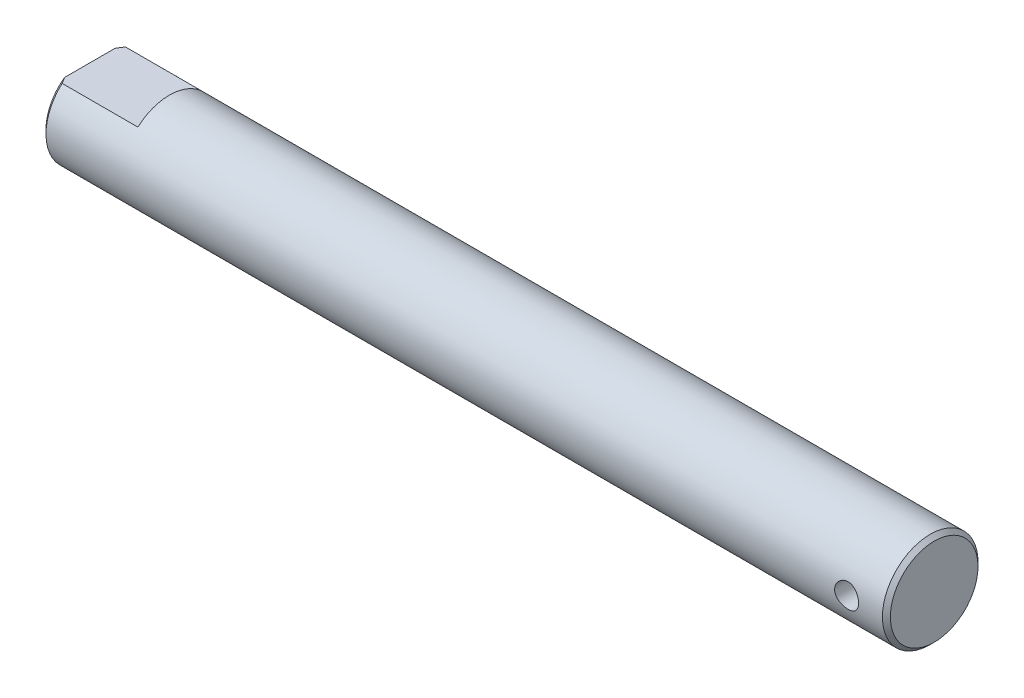
ISO-10303-21;
HEADER;
FILE_DESCRIPTION(('STEP AP214'),'2;1');
FILE_NAME('part.step','',(''),(''),'','','');
FILE_SCHEMA(('AUTOMOTIVE_DESIGN { 1 0 10303 214 1 1 1 1 }'));
ENDSEC;
DATA;
#1=APPLICATION_CONTEXT('core data for automotive mechanical design processes');
#2=APPLICATION_PROTOCOL_DEFINITION('international standard','automotive_design',2000,#1);
#3=PRODUCT_CONTEXT('',#1,'mechanical');
#4=PRODUCT('Part','Part','',(#3));
#5=PRODUCT_RELATED_PRODUCT_CATEGORY('part','',(#4));
#6=PRODUCT_DEFINITION_FORMATION('','',#4);
#7=PRODUCT_DEFINITION_CONTEXT('part definition',#1,'design');
#8=PRODUCT_DEFINITION('design','',#6,#7);
#9=PRODUCT_DEFINITION_SHAPE('','',#8);
#10=(LENGTH_UNIT() NAMED_UNIT(*) SI_UNIT(.MILLI.,.METRE.));
#11=(NAMED_UNIT(*) PLANE_ANGLE_UNIT() SI_UNIT($,.RADIAN.));
#12=(NAMED_UNIT(*) SI_UNIT($,.STERADIAN.) SOLID_ANGLE_UNIT());
#13=UNCERTAINTY_MEASURE_WITH_UNIT(LENGTH_MEASURE(1.E-05),#10,'distance_accuracy_value','');
#14=(GEOMETRIC_REPRESENTATION_CONTEXT(3) GLOBAL_UNCERTAINTY_ASSIGNED_CONTEXT((#13)) GLOBAL_UNIT_ASSIGNED_CONTEXT((#10,
#11,#12)) REPRESENTATION_CONTEXT('',''));
#15=CARTESIAN_POINT('',(0.,0.,0.));
#16=DIRECTION('',(0.,0.,1.));
#17=DIRECTION('',(1.,0.,0.));
#18=AXIS2_PLACEMENT_3D('',#15,#16,#17);
#19=CARTESIAN_POINT('',(106.,0.,0.));
#20=DIRECTION('',(-1.,0.,0.));
#21=DIRECTION('',(0.,0.,1.));
#22=AXIS2_PLACEMENT_3D('',#19,#20,#21);
#23=CYLINDRICAL_SURFACE('',#22,6.);
#24=CARTESIAN_POINT('',(102.5,0.,-6.));
#25=CARTESIAN_POINT('',(102.499997674262,0.0828760886697307,-5.99999859868013));
#26=CARTESIAN_POINT('',(102.493108449226,0.165778157830762,-5.99826578131828));
#27=CARTESIAN_POINT('',(102.465774848693,0.329206323770532,-5.99152113829892));
#28=CARTESIAN_POINT('',(102.445322790462,0.409731046870739,-5.98650745419968));
#29=CARTESIAN_POINT('',(102.391560746538,0.566020872182577,-5.9737562633204));
#30=CARTESIAN_POINT('',(102.358266201285,0.641791563430003,-5.96602202842087));
#31=CARTESIAN_POINT('',(102.279818609955,0.786672131904426,-5.94865343807593));
#32=CARTESIAN_POINT('',(102.234665163881,0.855781784348759,-5.9390190185405));
#33=CARTESIAN_POINT('',(102.132799210346,0.986801927300917,-5.91867413591801));
#34=CARTESIAN_POINT('',(102.075888425041,1.04855569006107,-5.90794707148533));
#35=CARTESIAN_POINT('',(101.952547795091,1.1617489272033,-5.8867362011753));
#36=CARTESIAN_POINT('',(101.886116877053,1.21318723694913,-5.87625242288348));
#37=CARTESIAN_POINT('',(101.744404773263,1.30502654279903,-5.8565477569971));
#38=CARTESIAN_POINT('',(101.66900676919,1.34525221592535,-5.84734794470605));
#39=CARTESIAN_POINT('',(101.512251588342,1.41239690855052,-5.83149494812223));
#40=CARTESIAN_POINT('',(101.430895366674,1.43931805543933,-5.82484135672789));
#41=CARTESIAN_POINT('',(101.266256501798,1.47855483680429,-5.81500476717551));
#42=CARTESIAN_POINT('',(101.18304510395,1.49115226833334,-5.81175491075426));
#43=CARTESIAN_POINT('',(101.015631430986,1.50226177506785,-5.80889362537741));
#44=CARTESIAN_POINT('',(100.931429319301,1.50077614181797,-5.80928160448644));
#45=CARTESIAN_POINT('',(100.766584192256,1.48398652463928,-5.81359205496618));
#46=CARTESIAN_POINT('',(100.685904378535,1.46901834019052,-5.81742863001879));
#47=CARTESIAN_POINT('',(100.528238949089,1.42622418690311,-5.82806709676484));
#48=CARTESIAN_POINT('',(100.451253596971,1.39839730206942,-5.83486919970697));
#49=CARTESIAN_POINT('',(100.302261983748,1.33038947793715,-5.85075113904187));
#50=CARTESIAN_POINT('',(100.23031382821,1.29008666723291,-5.85985327469421));
#51=CARTESIAN_POINT('',(100.094081290243,1.19835627601495,-5.87929710846386));
#52=CARTESIAN_POINT('',(100.029798251933,1.14692674880883,-5.88963902334735));
#53=CARTESIAN_POINT('',(99.9087963843056,1.03266342468121,-5.91075880539781));
#54=CARTESIAN_POINT('',(99.8523455099387,0.969546258165854,-5.92154069477972));
#55=CARTESIAN_POINT('',(99.7507787575361,0.834611917503697,-5.94205965578786));
#56=CARTESIAN_POINT('',(99.7056632257364,0.762794477707943,-5.95179669549415));
#57=CARTESIAN_POINT('',(99.6279494137756,0.612115888681392,-5.96917732094183));
#58=CARTESIAN_POINT('',(99.5953946597456,0.533231393208621,-5.97681360127725));
#59=CARTESIAN_POINT('',(99.5440826942904,0.370876008142878,-5.98907916991419));
#60=CARTESIAN_POINT('',(99.5253228435819,0.287405999150478,-5.99370903339281));
#61=CARTESIAN_POINT('',(99.5025424344412,0.12053997039002,-5.99935499271375));
#62=CARTESIAN_POINT('',(99.4981569739247,0.0371967199882034,-6.00046053508279));
#63=CARTESIAN_POINT('',(99.5032490020555,-0.129032874801513,-5.99918804814451));
#64=CARTESIAN_POINT('',(99.5127252427991,-0.211919259644599,-5.99681033241847));
#65=CARTESIAN_POINT('',(99.5449709083914,-0.373614268776496,-5.98889581127357));
#66=CARTESIAN_POINT('',(99.567541263477,-0.452465118968761,-5.98340634185811));
#67=CARTESIAN_POINT('',(99.6251070840284,-0.605257292452517,-5.96988706634134));
#68=CARTESIAN_POINT('',(99.6601038043132,-0.679198119032638,-5.96185700369892));
#69=CARTESIAN_POINT('',(99.7422361288747,-0.821523134429849,-5.9439330792631));
#70=CARTESIAN_POINT('',(99.7895761123968,-0.889785441835834,-5.93400867366932));
#71=CARTESIAN_POINT('',(99.894789908797,-1.01752661364325,-5.91344509187419));
#72=CARTESIAN_POINT('',(99.9526655396169,-1.07700395897301,-5.90280579251705));
#73=CARTESIAN_POINT('',(100.079001960844,-1.18699056807273,-5.88168956960771));
#74=CARTESIAN_POINT('',(100.147687703002,-1.23724386762203,-5.87122304187281));
#75=CARTESIAN_POINT('',(100.292732634466,-1.3255107590127,-5.85192878377239));
#76=CARTESIAN_POINT('',(100.36909148296,-1.36352489415794,-5.84310098067026));
#77=CARTESIAN_POINT('',(100.526905722413,-1.42595142060929,-5.82818094734665));
#78=CARTESIAN_POINT('',(100.608327628344,-1.45044439665406,-5.82207255291906));
#79=CARTESIAN_POINT('',(100.774309637889,-1.48534565995377,-5.81326744090184));
#80=CARTESIAN_POINT('',(100.858869051032,-1.49575702747865,-5.81056997719936));
#81=CARTESIAN_POINT('',(101.026121023855,-1.50203859033399,-5.80894901203957));
#82=CARTESIAN_POINT('',(101.108797435125,-1.49831789778011,-5.80991932728264));
#83=CARTESIAN_POINT('',(101.272303888668,-1.47737727831286,-5.81527909007843));
#84=CARTESIAN_POINT('',(101.353133968014,-1.46015762268677,-5.81966846891857));
#85=CARTESIAN_POINT('',(101.510208459065,-1.41293131944279,-5.83131260682723));
#86=CARTESIAN_POINT('',(101.58647730524,-1.38300140468037,-5.8385501523631));
#87=CARTESIAN_POINT('',(101.732965382714,-1.31126491360507,-5.85507755724829));
#88=CARTESIAN_POINT('',(101.803183773187,-1.26945669003418,-5.86436770120773));
#89=CARTESIAN_POINT('',(101.937554629002,-1.17386774863713,-5.88425634263512));
#90=CARTESIAN_POINT('',(102.001501073424,-1.11980316291224,-5.89488264831757));
#91=CARTESIAN_POINT('',(102.119547044795,-1.00178937118972,-5.91608027246286));
#92=CARTESIAN_POINT('',(102.173644230113,-0.937837821261139,-5.9266515772706));
#93=CARTESIAN_POINT('',(102.271411308565,-0.800467586702586,-5.94677655647663));
#94=CARTESIAN_POINT('',(102.314874613672,-0.726898422316381,-5.95630833365868));
#95=CARTESIAN_POINT('',(102.388747462941,-0.573266059510468,-5.97304924975119));
#96=CARTESIAN_POINT('',(102.419166360649,-0.493207563436732,-5.98026005199781));
#97=CARTESIAN_POINT('',(102.46157183033,-0.344410253243466,-5.99048059565542));
#98=CARTESIAN_POINT('',(102.475951243053,-0.276380170908064,-5.99402585052691));
#99=CARTESIAN_POINT('',(102.495165943622,-0.138906071536281,-5.99878605231948));
#100=CARTESIAN_POINT('',(102.500001949305,-0.0694621612426151,-6.00000117450894));
#101=CARTESIAN_POINT('',(102.5,0.,-6.));
#102=B_SPLINE_CURVE_WITH_KNOTS('',3,(#24,#25,#26,#27,#28,#29,#30,#31,#32,#33,#34,#35,#36,#37,
#38,#39,#40,#41,#42,#43,#44,#45,#46,#47,#48,#49,#50,#51,#52,#53,#54,#55,#56,#57,#58,#59,#60,#61,
#62,#63,#64,#65,#66,#67,#68,#69,#70,#71,#72,#73,#74,#75,#76,#77,#78,#79,#80,#81,#82,#83,#84,#85,
#86,#87,#88,#89,#90,#91,#92,#93,#94,#95,#96,#97,#98,#99,#100,#101),.UNSPECIFIED.,.T.,.F.,(4,2,2,
2,2,2,2,2,2,2,2,2,2,2,2,2,2,2,2,2,2,2,2,2,2,2,2,2,2,2,2,2,2,2,2,2,2,2,4),(0.,0.248373712471889,
0.496888237763901,0.745104902286105,0.993329940169326,1.24614435437138,1.49898729580061,
1.75558647545806,2.01214461169368,2.2635629509943,2.51494038112696,2.76022497007017,
3.00552703466037,3.25330527873879,3.50112690836162,3.75601500969019,4.01091089558246,
4.26668229009113,4.52240473688642,4.77158308949276,5.02073901112742,5.26620274514037,
5.5116912732229,5.76153587565351,6.01142363008018,6.26744509204475,6.52345518749507,
6.77792254614035,7.03233423252406,7.27943780398612,7.52653640956033,7.77216400559445,
8.017825681369,8.26989576409911,8.52202569770416,8.77872185499586,9.03523363821349,
9.24342242942147,9.45159556043037),.UNSPECIFIED.);
#103=CARTESIAN_POINT('',(102.5,0.,-6.));
#104=VERTEX_POINT('',#103);
#105=EDGE_CURVE('E11',#104,#104,#102,.T.);
#106=ORIENTED_EDGE('',*,*,#105,.T.);
#107=EDGE_LOOP('',(#106));
#108=FACE_BOUND('',#107,.T.);
#109=CARTESIAN_POINT('',(102.5,0.,6.));
#110=CARTESIAN_POINT('',(102.499997674262,-0.0828760886697309,5.99999859868012));
#111=CARTESIAN_POINT('',(102.493108449226,-0.165778157830763,5.99826578131828));
#112=CARTESIAN_POINT('',(102.465774848693,-0.329206323770532,5.99152113829892));
#113=CARTESIAN_POINT('',(102.445322790462,-0.40973104687074,5.98650745419968));
#114=CARTESIAN_POINT('',(102.391560746538,-0.566020872182578,5.9737562633204));
#115=CARTESIAN_POINT('',(102.358266201285,-0.641791563430003,5.96602202842087));
#116=CARTESIAN_POINT('',(102.279818609955,-0.786672131904426,5.94865343807593));
#117=CARTESIAN_POINT('',(102.234665163881,-0.855781784348759,5.9390190185405));
#118=CARTESIAN_POINT('',(102.132799210346,-0.986801927300918,5.91867413591801));
#119=CARTESIAN_POINT('',(102.075888425041,-1.04855569006107,5.90794707148533));
#120=CARTESIAN_POINT('',(101.952547795091,-1.1617489272033,5.8867362011753));
#121=CARTESIAN_POINT('',(101.886116877053,-1.21318723694913,5.87625242288348));
#122=CARTESIAN_POINT('',(101.744404773263,-1.30502654279903,5.8565477569971));
#123=CARTESIAN_POINT('',(101.66900676919,-1.34525221592535,5.84734794470605));
#124=CARTESIAN_POINT('',(101.512251588342,-1.41239690855052,5.83149494812223));
#125=CARTESIAN_POINT('',(101.430895366674,-1.43931805543933,5.82484135672789));
#126=CARTESIAN_POINT('',(101.266256501798,-1.47855483680429,5.81500476717551));
#127=CARTESIAN_POINT('',(101.18304510395,-1.49115226833333,5.81175491075426));
#128=CARTESIAN_POINT('',(101.015631430986,-1.50226177506785,5.80889362537741));
#129=CARTESIAN_POINT('',(100.931429319301,-1.50077614181798,5.80928160448644));
#130=CARTESIAN_POINT('',(100.766584192256,-1.48398652463928,5.81359205496618));
#131=CARTESIAN_POINT('',(100.685904378535,-1.46901834019052,5.81742863001879));
#132=CARTESIAN_POINT('',(100.528238949089,-1.4262241869031,5.82806709676484));
#133=CARTESIAN_POINT('',(100.451253596971,-1.39839730206942,5.83486919970697));
#134=CARTESIAN_POINT('',(100.302261983748,-1.33038947793715,5.85075113904187));
#135=CARTESIAN_POINT('',(100.23031382821,-1.29008666723291,5.85985327469421));
#136=CARTESIAN_POINT('',(100.094081290243,-1.19835627601495,5.87929710846386));
#137=CARTESIAN_POINT('',(100.029798251933,-1.14692674880883,5.88963902334735));
#138=CARTESIAN_POINT('',(99.9087963843056,-1.03266342468121,5.91075880539781));
#139=CARTESIAN_POINT('',(99.8523455099387,-0.969546258165853,5.92154069477972));
#140=CARTESIAN_POINT('',(99.7507787575361,-0.834611917503697,5.94205965578786));
#141=CARTESIAN_POINT('',(99.7056632257364,-0.762794477707943,5.95179669549415));
#142=CARTESIAN_POINT('',(99.6279494137756,-0.612115888681391,5.96917732094183));
#143=CARTESIAN_POINT('',(99.5953946597456,-0.533231393208621,5.97681360127725));
#144=CARTESIAN_POINT('',(99.5440826942904,-0.370876008142877,5.98907916991419));
#145=CARTESIAN_POINT('',(99.5253228435819,-0.287405999150478,5.99370903339281));
#146=CARTESIAN_POINT('',(99.5025424344412,-0.120539970390019,5.99935499271375));
#147=CARTESIAN_POINT('',(99.4981569739247,-0.0371967199882027,6.00046053508279));
#148=CARTESIAN_POINT('',(99.5032490020555,0.129032874801514,5.99918804814451));
#149=CARTESIAN_POINT('',(99.5127252427991,0.211919259644599,5.99681033241847));
#150=CARTESIAN_POINT('',(99.5449709083914,0.373614268776497,5.98889581127357));
#151=CARTESIAN_POINT('',(99.567541263477,0.452465118968762,5.98340634185811));
#152=CARTESIAN_POINT('',(99.6251070840284,0.605257292452518,5.96988706634134));
#153=CARTESIAN_POINT('',(99.6601038043132,0.679198119032638,5.96185700369892));
#154=CARTESIAN_POINT('',(99.7422361288747,0.82152313442985,5.9439330792631));
#155=CARTESIAN_POINT('',(99.7895761123968,0.889785441835834,5.93400867366932));
#156=CARTESIAN_POINT('',(99.894789908797,1.01752661364325,5.91344509187419));
#157=CARTESIAN_POINT('',(99.9526655396169,1.07700395897301,5.90280579251705));
#158=CARTESIAN_POINT('',(100.079001960844,1.18699056807273,5.88168956960771));
#159=CARTESIAN_POINT('',(100.147687703002,1.23724386762203,5.87122304187281));
#160=CARTESIAN_POINT('',(100.292732634466,1.3255107590127,5.85192878377239));
#161=CARTESIAN_POINT('',(100.36909148296,1.36352489415794,5.84310098067026));
#162=CARTESIAN_POINT('',(100.526905722413,1.42595142060929,5.82818094734665));
#163=CARTESIAN_POINT('',(100.608327628344,1.45044439665406,5.82207255291906));
#164=CARTESIAN_POINT('',(100.774309637889,1.48534565995378,5.81326744090184));
#165=CARTESIAN_POINT('',(100.858869051032,1.49575702747866,5.81056997719936));
#166=CARTESIAN_POINT('',(101.026121023855,1.50203859033399,5.80894901203957));
#167=CARTESIAN_POINT('',(101.108797435125,1.49831789778011,5.80991932728264));
#168=CARTESIAN_POINT('',(101.272303888668,1.47737727831286,5.81527909007843));
#169=CARTESIAN_POINT('',(101.353133968014,1.46015762268677,5.81966846891857));
#170=CARTESIAN_POINT('',(101.510208459065,1.41293131944279,5.83131260682723));
#171=CARTESIAN_POINT('',(101.58647730524,1.38300140468037,5.8385501523631));
#172=CARTESIAN_POINT('',(101.732965382714,1.31126491360506,5.85507755724829));
#173=CARTESIAN_POINT('',(101.803183773187,1.26945669003418,5.86436770120773));
#174=CARTESIAN_POINT('',(101.937554629002,1.17386774863713,5.88425634263512));
#175=CARTESIAN_POINT('',(102.001501073424,1.11980316291224,5.89488264831757));
#176=CARTESIAN_POINT('',(102.119547044795,1.00178937118972,5.91608027246286));
#177=CARTESIAN_POINT('',(102.173644230113,0.937837821261138,5.9266515772706));
#178=CARTESIAN_POINT('',(102.271411308565,0.800467586702584,5.94677655647663));
#179=CARTESIAN_POINT('',(102.314874613672,0.726898422316379,5.95630833365868));
#180=CARTESIAN_POINT('',(102.388747462941,0.573266059510466,5.97304924975119));
#181=CARTESIAN_POINT('',(102.419166360649,0.49320756343673,5.98026005199781));
#182=CARTESIAN_POINT('',(102.46157183033,0.344410253243465,5.99048059565542));
#183=CARTESIAN_POINT('',(102.475951243053,0.276380170908063,5.99402585052691));
#184=CARTESIAN_POINT('',(102.495165943622,0.138906071536281,5.99878605231948));
#185=CARTESIAN_POINT('',(102.500001949305,0.0694621612426152,6.00000117450894));
#186=CARTESIAN_POINT('',(102.5,0.,6.));
#187=B_SPLINE_CURVE_WITH_KNOTS('',3,(#109,#110,#111,#112,#113,#114,#115,#116,#117,#118,#119,
#120,#121,#122,#123,#124,#125,#126,#127,#128,#129,#130,#131,#132,#133,#134,#135,#136,#137,#138,
#139,#140,#141,#142,#143,#144,#145,#146,#147,#148,#149,#150,#151,#152,#153,#154,#155,#156,#157,
#158,#159,#160,#161,#162,#163,#164,#165,#166,#167,#168,#169,#170,#171,#172,#173,#174,#175,#176,
#177,#178,#179,#180,#181,#182,#183,#184,#185,#186),.UNSPECIFIED.,.T.,.F.,(4,2,2,2,2,2,2,2,2,2,2,
2,2,2,2,2,2,2,2,2,2,2,2,2,2,2,2,2,2,2,2,2,2,2,2,2,2,2,4),(0.,0.24837371247189,0.496888237763901,
0.745104902286105,0.993329940169327,1.24614435437138,1.49898729580062,1.75558647545806,
2.01214461169368,2.26356295099429,2.51494038112696,2.76022497007018,3.00552703466038,
3.25330527873879,3.50112690836162,3.75601500969019,4.01091089558246,4.26668229009113,
4.52240473688643,4.77158308949276,5.02073901112742,5.26620274514037,5.5116912732229,
5.76153587565352,6.01142363008018,6.26744509204475,6.52345518749507,6.77792254614035,
7.03233423252408,7.27943780398612,7.52653640956034,7.77216400559447,8.017825681369,
8.26989576409911,8.52202569770416,8.77872185499588,9.03523363821349,9.24342242942148,
9.45159556043038),.UNSPECIFIED.);
#188=CARTESIAN_POINT('',(102.5,0.,6.));
#189=VERTEX_POINT('',#188);
#190=EDGE_CURVE('E53',#189,#189,#187,.T.);
#191=ORIENTED_EDGE('',*,*,#190,.T.);
#192=EDGE_LOOP('',(#191));
#193=FACE_BOUND('',#192,.T.);
#194=CARTESIAN_POINT('',(9.99999999999999,0.,0.));
#195=DIRECTION('',(-1.,0.,0.));
#196=DIRECTION('',(0.,0.,1.));
#197=AXIS2_PLACEMENT_3D('',#194,#195,#196);
#198=CIRCLE('',#197,6.);
#199=CARTESIAN_POINT('',(9.99999999999999,4.5,3.96862696659689));
#200=VERTEX_POINT('',#199);
#201=CARTESIAN_POINT('',(9.99999999999999,4.5,-3.96862696659689));
#202=VERTEX_POINT('',#201);
#203=EDGE_CURVE('E83',#200,#202,#198,.T.);
#204=ORIENTED_EDGE('',*,*,#203,.F.);
#205=DIRECTION('',(-1.,0.,0.));
#206=VECTOR('',#205,1.);
#207=CARTESIAN_POINT('',(106.,4.5,3.96862696659689));
#208=LINE('',#207,#206);
#209=CARTESIAN_POINT('',(0.499999999999987,4.5,3.96862696659689));
#210=VERTEX_POINT('',#209);
#211=EDGE_CURVE('E145',#200,#210,#208,.T.);
#212=ORIENTED_EDGE('',*,*,#211,.T.);
#213=CARTESIAN_POINT('',(0.499999999999987,0.,0.));
#214=DIRECTION('',(1.,0.,0.));
#215=DIRECTION('',(0.,0.,-1.));
#216=AXIS2_PLACEMENT_3D('',#213,#214,#215);
#217=CIRCLE('',#216,6.);
#218=CARTESIAN_POINT('',(0.499999999999987,4.5,-3.96862696659689));
#219=VERTEX_POINT('',#218);
#220=EDGE_CURVE('E94',#210,#219,#217,.T.);
#221=ORIENTED_EDGE('',*,*,#220,.T.);
#222=DIRECTION('',(-1.,0.,0.));
#223=VECTOR('',#222,1.);
#224=CARTESIAN_POINT('',(106.,4.5,-3.96862696659689));
#225=LINE('',#224,#223);
#226=EDGE_CURVE('E66',#219,#202,#225,.F.);
#227=ORIENTED_EDGE('',*,*,#226,.T.);
#228=EDGE_LOOP('',(#204,#212,#221,#227));
#229=FACE_BOUND('',#228,.T.);
#230=CARTESIAN_POINT('',(105.5,0.,0.));
#231=DIRECTION('',(1.,0.,0.));
#232=DIRECTION('',(0.,0.,-1.));
#233=AXIS2_PLACEMENT_3D('',#230,#231,#232);
#234=CIRCLE('',#233,6.);
#235=CARTESIAN_POINT('',(105.5,0.,-6.));
#236=VERTEX_POINT('',#235);
#237=EDGE_CURVE('E98',#236,#236,#234,.F.);
#238=ORIENTED_EDGE('',*,*,#237,.T.);
#239=EDGE_LOOP('',(#238));
#240=FACE_BOUND('',#239,.T.);
#241=ADVANCED_FACE('F39',(#108,#193,#229,#240),#23,.T.);
#242=CARTESIAN_POINT('',(106.,0.,0.));
#243=DIRECTION('',(1.,0.,0.));
#244=DIRECTION('',(0.,0.,-1.));
#245=AXIS2_PLACEMENT_3D('',#242,#243,#244);
#246=PLANE('',#245);
#247=CARTESIAN_POINT('',(106.,0.,0.));
#248=DIRECTION('',(1.,0.,0.));
#249=DIRECTION('',(0.,0.,-1.));
#250=AXIS2_PLACEMENT_3D('',#247,#248,#249);
#251=CIRCLE('',#250,5.50000000000003);
#252=CARTESIAN_POINT('',(106.,0.,-5.50000000000003));
#253=VERTEX_POINT('',#252);
#254=EDGE_CURVE('E93',#253,#253,#251,.T.);
#255=ORIENTED_EDGE('',*,*,#254,.T.);
#256=EDGE_LOOP('',(#255));
#257=FACE_BOUND('',#256,.T.);
#258=ADVANCED_FACE('F115',(#257),#246,.T.);
#259=CARTESIAN_POINT('',(0.,0.,0.));
#260=DIRECTION('',(1.,0.,0.));
#261=DIRECTION('',(0.,0.,-1.));
#262=AXIS2_PLACEMENT_3D('',#259,#260,#261);
#263=PLANE('',#262);
#264=CARTESIAN_POINT('',(0.,0.,0.));
#265=DIRECTION('',(1.,0.,0.));
#266=DIRECTION('',(0.,0.,-1.));
#267=AXIS2_PLACEMENT_3D('',#264,#265,#266);
#268=CIRCLE('',#267,5.49999999999999);
#269=CARTESIAN_POINT('',(0.,4.5,-3.16227766016837));
#270=VERTEX_POINT('',#269);
#271=CARTESIAN_POINT('',(0.,4.5,3.16227766016837));
#272=VERTEX_POINT('',#271);
#273=EDGE_CURVE('E89',#270,#272,#268,.F.);
#274=ORIENTED_EDGE('',*,*,#273,.T.);
#275=DIRECTION('',(0.,0.,1.));
#276=VECTOR('',#275,1.);
#277=CARTESIAN_POINT('',(0.,4.5,-5.76257927946265));
#278=LINE('',#277,#276);
#279=EDGE_CURVE('E60',#270,#272,#278,.T.);
#280=ORIENTED_EDGE('',*,*,#279,.F.);
#281=EDGE_LOOP('',(#274,#280));
#282=FACE_BOUND('',#281,.T.);
#283=ADVANCED_FACE('F88',(#282),#263,.F.);
#284=CARTESIAN_POINT('',(0.499999999999987,0.,0.));
#285=DIRECTION('',(1.,0.,0.));
#286=DIRECTION('',(0.,0.,-1.));
#287=AXIS2_PLACEMENT_3D('',#284,#285,#286);
#288=CONICAL_SURFACE('',#287,6.,0.785398163397471);
#289=CARTESIAN_POINT('',(0.500700000000324,4.5,-3.96968518777045));
#290=CARTESIAN_POINT('',(0.437009989957209,4.5,-3.87339264212766));
#291=CARTESIAN_POINT('',(0.374207673157163,4.5,-3.77650441507906));
#292=CARTESIAN_POINT('',(0.250693655070821,4.5,-3.58137101964523));
#293=CARTESIAN_POINT('',(0.189982495737876,4.5,-3.48312550860704));
#294=CARTESIAN_POINT('',(0.0706867410994751,4.5,-3.28464161125446));
#295=CARTESIAN_POINT('',(0.0121149862913564,4.5,-3.18439546930312));
#296=CARTESIAN_POINT('',(-0.102127102067324,4.5,-2.98227588858412));
#297=CARTESIAN_POINT('',(-0.157797627247815,4.5,-2.88040255787655));
#298=CARTESIAN_POINT('',(-0.322877952428692,4.5,-2.56614314186718));
#299=CARTESIAN_POINT('',(-0.426847271659996,4.5,-2.35083682891543));
#300=CARTESIAN_POINT('',(-0.614685979016808,4.5,-1.91191588938568));
#301=CARTESIAN_POINT('',(-0.698598528884141,4.5,-1.68832032192078));
#302=CARTESIAN_POINT('',(-0.810192158096138,4.5,-1.32682203176174));
#303=CARTESIAN_POINT('',(-0.846783123178628,4.5,-1.19167293079571));
#304=CARTESIAN_POINT('',(-0.909069667919463,4.5,-0.918838291994869));
#305=CARTESIAN_POINT('',(-0.934764908812977,4.5,-0.781152675434737));
#306=CARTESIAN_POINT('',(-0.973703163724229,4.5,-0.505686776709133));
#307=CARTESIAN_POINT('',(-0.987091375501523,4.5,-0.367927305666166));
#308=CARTESIAN_POINT('',(-1.00117673263348,4.5,-0.0917592093994528));
#309=CARTESIAN_POINT('',(-1.00187480943151,4.5,0.0466493674346533));
#310=CARTESIAN_POINT('',(-0.990536239138376,4.5,0.323024452129332));
#311=CARTESIAN_POINT('',(-0.978491362302788,4.5,0.460990616515674));
#312=CARTESIAN_POINT('',(-0.942347341385414,4.5,0.735324495961267));
#313=CARTESIAN_POINT('',(-0.918246800350637,4.5,0.871692023903557));
#314=CARTESIAN_POINT('',(-0.858874582924122,4.5,1.14362252943263));
#315=CARTESIAN_POINT('',(-0.823474826621658,4.5,1.27915717091655));
#316=CARTESIAN_POINT('',(-0.743127192322243,4.5,1.54732429372746));
#317=CARTESIAN_POINT('',(-0.698179339578131,4.5,1.67995678272906));
#318=CARTESIAN_POINT('',(-0.57679958662692,4.5,2.00507503766939));
#319=CARTESIAN_POINT('',(-0.495603685789314,4.5,2.19577611276917));
#320=CARTESIAN_POINT('',(-0.319949230992929,4.5,2.57108474811645));
#321=CARTESIAN_POINT('',(-0.22547654501121,4.5,2.75568555310627));
#322=CARTESIAN_POINT('',(-0.0293562287012536,4.5,3.11446237166649));
#323=CARTESIAN_POINT('',(0.0720246867940939,4.5,3.28878541271145));
#324=CARTESIAN_POINT('',(0.2292901234459,4.5,3.54674167901052));
#325=CARTESIAN_POINT('',(0.282501875963735,4.5,3.63202566750182));
#326=CARTESIAN_POINT('',(0.390482383121968,4.5,3.8015845938077));
#327=CARTESIAN_POINT('',(0.445250897175719,4.5,3.88585968471012));
#328=CARTESIAN_POINT('',(0.500699999999987,4.5,3.96968518776993));
#329=B_SPLINE_CURVE_WITH_KNOTS('',3,(#289,#290,#291,#292,#293,#294,#295,#296,#297,#298,#299,
#300,#301,#302,#303,#304,#305,#306,#307,#308,#309,#310,#311,#312,#313,#314,#315,#316,#317,#318,
#319,#320,#321,#322,#323,#324,#325,#326,#327,#328),.UNSPECIFIED.,.F.,.F.,(4,2,2,2,2,2,2,2,2,2,2,
2,2,2,2,2,2,2,2,4),(0.,0.346354756881394,0.692798611306342,1.04106163248083,1.38930162120604,
2.1058764853685,2.82089512487718,3.24056561164809,3.6602491456637,4.07491522819945,
4.48955087453195,4.90445446735145,5.31940614836541,5.73923924226722,6.15907122580686,
6.78014680302734,7.40188854186495,8.00663509482336,8.30819079976105,8.60970015206771),.UNSPECIFIED.);
#330=EDGE_CURVE('E77',#219,#270,#329,.T.);
#331=ORIENTED_EDGE('',*,*,#330,.F.);
#332=ORIENTED_EDGE('',*,*,#220,.F.);
#333=EDGE_CURVE('E84',#272,#210,#329,.T.);
#334=ORIENTED_EDGE('',*,*,#333,.F.);
#335=ORIENTED_EDGE('',*,*,#273,.F.);
#336=EDGE_LOOP('',(#331,#332,#334,#335));
#337=FACE_BOUND('',#336,.T.);
#338=ADVANCED_FACE('F92',(#337),#288,.T.);
#339=CARTESIAN_POINT('',(106.,0.,0.));
#340=DIRECTION('',(-1.,0.,0.));
#341=DIRECTION('',(0.,0.,1.));
#342=AXIS2_PLACEMENT_3D('',#339,#340,#341);
#343=CONICAL_SURFACE('',#342,5.50000000000003,0.785398163397458);
#344=ORIENTED_EDGE('',*,*,#237,.F.);
#345=EDGE_LOOP('',(#344));
#346=FACE_BOUND('',#345,.T.);
#347=ORIENTED_EDGE('',*,*,#254,.F.);
#348=EDGE_LOOP('',(#347));
#349=FACE_BOUND('',#348,.T.);
#350=ADVANCED_FACE('F42',(#346,#349),#343,.T.);
#351=CARTESIAN_POINT('',(10.,0.,0.));
#352=DIRECTION('',(-1.,0.,0.));
#353=DIRECTION('',(0.,0.,1.));
#354=AXIS2_PLACEMENT_3D('',#351,#352,#353);
#355=PLANE('',#354);
#356=ORIENTED_EDGE('',*,*,#203,.T.);
#357=DIRECTION('',(0.,0.,1.));
#358=VECTOR('',#357,1.);
#359=CARTESIAN_POINT('',(10.,4.5,-5.76257927946265));
#360=LINE('',#359,#358);
#361=EDGE_CURVE('E90',#202,#200,#360,.T.);
#362=ORIENTED_EDGE('',*,*,#361,.T.);
#363=EDGE_LOOP('',(#356,#362));
#364=FACE_BOUND('',#363,.T.);
#365=ADVANCED_FACE('F114',(#364),#355,.T.);
#366=CARTESIAN_POINT('',(10.,4.5,-5.76257927946265));
#367=DIRECTION('',(0.,-1.,0.));
#368=DIRECTION('',(0.,0.,-1.));
#369=AXIS2_PLACEMENT_3D('',#366,#367,#368);
#370=PLANE('',#369);
#371=ORIENTED_EDGE('',*,*,#330,.T.);
#372=ORIENTED_EDGE('',*,*,#279,.T.);
#373=ORIENTED_EDGE('',*,*,#333,.T.);
#374=ORIENTED_EDGE('',*,*,#211,.F.);
#375=ORIENTED_EDGE('',*,*,#361,.F.);
#376=ORIENTED_EDGE('',*,*,#226,.F.);
#377=EDGE_LOOP('',(#371,#372,#373,#374,#375,#376));
#378=FACE_BOUND('',#377,.T.);
#379=ADVANCED_FACE('F78',(#378),#370,.F.);
#380=CARTESIAN_POINT('',(101.,0.,-6.));
#381=DIRECTION('',(0.,0.,1.));
#382=DIRECTION('',(1.,0.,0.));
#383=AXIS2_PLACEMENT_3D('',#380,#381,#382);
#384=CYLINDRICAL_SURFACE('',#383,1.5);
#385=ORIENTED_EDGE('',*,*,#190,.F.);
#386=EDGE_LOOP('',(#385));
#387=FACE_BOUND('',#386,.T.);
#388=ORIENTED_EDGE('',*,*,#105,.F.);
#389=EDGE_LOOP('',(#388));
#390=FACE_BOUND('',#389,.T.);
#391=ADVANCED_FACE('F113',(#387,#390),#384,.F.);
#392=CLOSED_SHELL('',(#241,#258,#283,#338,#350,#365,#379,#391));
#393=MANIFOLD_SOLID_BREP('B2',#392);
#394=ADVANCED_BREP_SHAPE_REPRESENTATION('',(#18,#393),#14);
#395=SHAPE_DEFINITION_REPRESENTATION(#9,#394);
ENDSEC;
END-ISO-10303-21;
